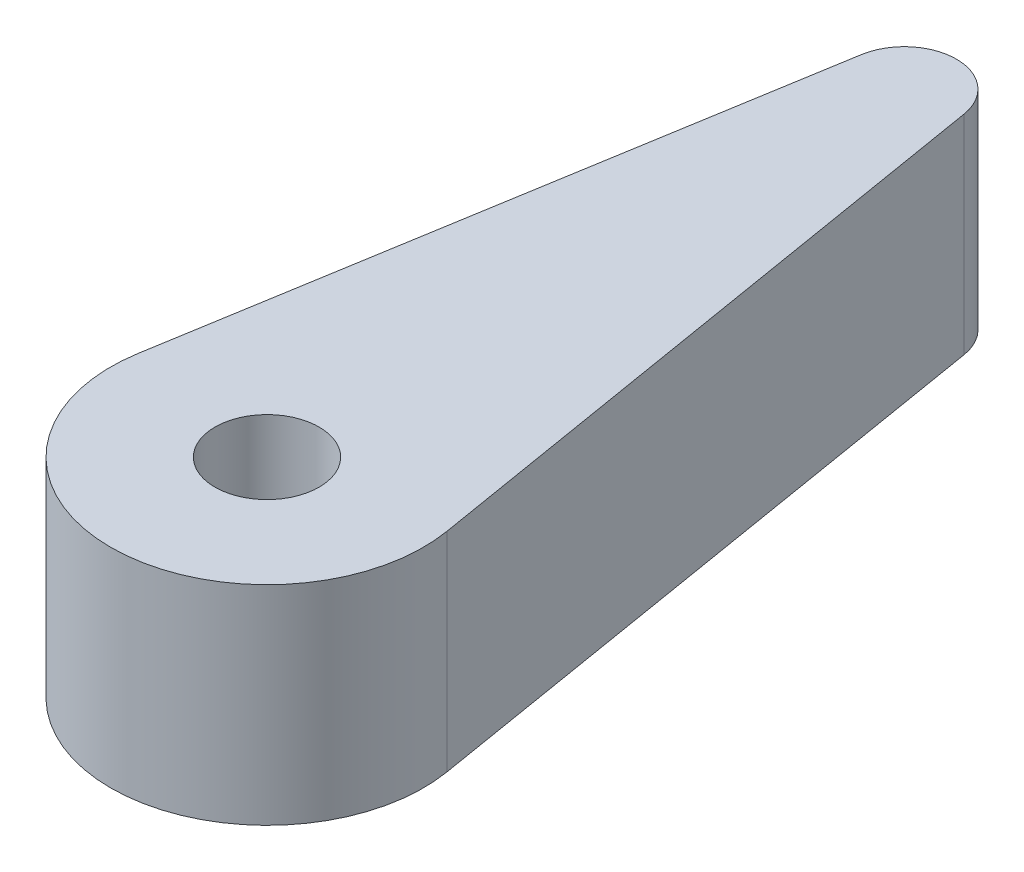
ISO-10303-21;
HEADER;
FILE_DESCRIPTION(('STEP AP214'),'2;1');
FILE_NAME('part.step','',(''),(''),'','','');
FILE_SCHEMA(('AUTOMOTIVE_DESIGN { 1 0 10303 214 1 1 1 1 }'));
ENDSEC;
DATA;
#1=APPLICATION_CONTEXT('core data for automotive mechanical design processes');
#2=APPLICATION_PROTOCOL_DEFINITION('international standard','automotive_design',2000,#1);
#3=PRODUCT_CONTEXT('',#1,'mechanical');
#4=PRODUCT('Part','Part','',(#3));
#5=PRODUCT_RELATED_PRODUCT_CATEGORY('part','',(#4));
#6=PRODUCT_DEFINITION_FORMATION('','',#4);
#7=PRODUCT_DEFINITION_CONTEXT('part definition',#1,'design');
#8=PRODUCT_DEFINITION('design','',#6,#7);
#9=PRODUCT_DEFINITION_SHAPE('','',#8);
#10=(LENGTH_UNIT() NAMED_UNIT(*) SI_UNIT(.MILLI.,.METRE.));
#11=(NAMED_UNIT(*) PLANE_ANGLE_UNIT() SI_UNIT($,.RADIAN.));
#12=(NAMED_UNIT(*) SI_UNIT($,.STERADIAN.) SOLID_ANGLE_UNIT());
#13=UNCERTAINTY_MEASURE_WITH_UNIT(LENGTH_MEASURE(1.E-05),#10,'distance_accuracy_value','');
#14=(GEOMETRIC_REPRESENTATION_CONTEXT(3) GLOBAL_UNCERTAINTY_ASSIGNED_CONTEXT((#13)) GLOBAL_UNIT_ASSIGNED_CONTEXT((#10,
#11,#12)) REPRESENTATION_CONTEXT('',''));
#15=CARTESIAN_POINT('',(0.,0.,0.));
#16=DIRECTION('',(0.,0.,1.));
#17=DIRECTION('',(1.,0.,0.));
#18=AXIS2_PLACEMENT_3D('',#15,#16,#17);
#19=CARTESIAN_POINT('',(0.,10.,0.));
#20=DIRECTION('',(0.,1.,0.));
#21=DIRECTION('',(0.,0.,1.));
#22=AXIS2_PLACEMENT_3D('',#19,#20,#21);
#23=PLANE('',#22);
#24=CARTESIAN_POINT('',(0.,10.,0.));
#25=DIRECTION('',(0.,1.,0.));
#26=DIRECTION('',(0.,0.,1.));
#27=AXIS2_PLACEMENT_3D('',#24,#25,#26);
#28=CIRCLE('',#27,7.5);
#29=CARTESIAN_POINT('',(-7.39904990575365,10.,-1.22640144005418));
#30=VERTEX_POINT('',#29);
#31=CARTESIAN_POINT('',(7.39904920314467,10.,-1.22640567898401));
#32=VERTEX_POINT('',#31);
#33=EDGE_CURVE('E92',#30,#32,#28,.T.);
#34=ORIENTED_EDGE('',*,*,#33,.T.);
#35=DIRECTION('',(-0.163520757197867,0.,-0.986539893752623));
#36=VECTOR('',#35,1.);
#37=CARTESIAN_POINT('',(7.39904920314467,10.,-1.22640567898401));
#38=LINE('',#37,#36);
#39=CARTESIAN_POINT('',(2.4678527212166,10.,-30.9768920191859));
#40=VERTEX_POINT('',#39);
#41=EDGE_CURVE('E87',#32,#40,#38,.T.);
#42=ORIENTED_EDGE('',*,*,#41,.T.);
#43=CARTESIAN_POINT('',(0.,10.,-30.5772635087117));
#44=DIRECTION('',(0.,1.,0.));
#45=DIRECTION('',(0.,0.,1.));
#46=AXIS2_PLACEMENT_3D('',#43,#44,#45);
#47=CIRCLE('',#46,2.5);
#48=CARTESIAN_POINT('',(-2.46634996858455,10.,-30.9860639887297));
#49=VERTEX_POINT('',#48);
#50=EDGE_CURVE('E90',#40,#49,#47,.T.);
#51=ORIENTED_EDGE('',*,*,#50,.T.);
#52=DIRECTION('',(-0.163520192007223,0.,0.98653998743382));
#53=VECTOR('',#52,1.);
#54=CARTESIAN_POINT('',(-7.39904990575365,10.,-1.22640144005418));
#55=LINE('',#54,#53);
#56=EDGE_CURVE('E57',#49,#30,#55,.T.);
#57=ORIENTED_EDGE('',*,*,#56,.T.);
#58=EDGE_LOOP('',(#34,#42,#51,#57));
#59=FACE_BOUND('',#58,.T.);
#60=CARTESIAN_POINT('',(0.,10.,0.));
#61=DIRECTION('',(0.,1.,0.));
#62=DIRECTION('',(0.,0.,1.));
#63=AXIS2_PLACEMENT_3D('',#60,#61,#62);
#64=CIRCLE('',#63,2.5);
#65=CARTESIAN_POINT('',(0.,10.,2.5));
#66=VERTEX_POINT('',#65);
#67=EDGE_CURVE('E112',#66,#66,#64,.T.);
#68=ORIENTED_EDGE('',*,*,#67,.F.);
#69=EDGE_LOOP('',(#68));
#70=FACE_BOUND('',#69,.T.);
#71=ADVANCED_FACE('F39',(#59,#70),#23,.T.);
#72=CARTESIAN_POINT('',(0.,0.,0.));
#73=DIRECTION('',(0.,1.,0.));
#74=DIRECTION('',(0.,0.,1.));
#75=AXIS2_PLACEMENT_3D('',#72,#73,#74);
#76=PLANE('',#75);
#77=CARTESIAN_POINT('',(0.,0.,0.));
#78=DIRECTION('',(0.,1.,0.));
#79=DIRECTION('',(0.,0.,1.));
#80=AXIS2_PLACEMENT_3D('',#77,#78,#79);
#81=CIRCLE('',#80,7.5);
#82=CARTESIAN_POINT('',(-7.39904990575365,0.,-1.22640144005418));
#83=VERTEX_POINT('',#82);
#84=CARTESIAN_POINT('',(7.39904920314467,0.,-1.22640567898401));
#85=VERTEX_POINT('',#84);
#86=EDGE_CURVE('E108',#83,#85,#81,.T.);
#87=ORIENTED_EDGE('',*,*,#86,.F.);
#88=DIRECTION('',(-0.163520192007223,0.,0.98653998743382));
#89=VECTOR('',#88,1.);
#90=CARTESIAN_POINT('',(-7.39904990575365,0.,-1.22640144005418));
#91=LINE('',#90,#89);
#92=CARTESIAN_POINT('',(-2.46634996858455,0.,-30.9860639887297));
#93=VERTEX_POINT('',#92);
#94=EDGE_CURVE('E80',#93,#83,#91,.T.);
#95=ORIENTED_EDGE('',*,*,#94,.F.);
#96=CARTESIAN_POINT('',(0.,0.,-30.5772635087117));
#97=DIRECTION('',(0.,1.,0.));
#98=DIRECTION('',(0.,0.,1.));
#99=AXIS2_PLACEMENT_3D('',#96,#97,#98);
#100=CIRCLE('',#99,2.5);
#101=CARTESIAN_POINT('',(2.4678527212166,0.,-30.9768920191859));
#102=VERTEX_POINT('',#101);
#103=EDGE_CURVE('E74',#102,#93,#100,.T.);
#104=ORIENTED_EDGE('',*,*,#103,.F.);
#105=DIRECTION('',(-0.163520757197867,0.,-0.986539893752623));
#106=VECTOR('',#105,1.);
#107=CARTESIAN_POINT('',(7.39904920314467,0.,-1.22640567898401));
#108=LINE('',#107,#106);
#109=EDGE_CURVE('E97',#85,#102,#108,.T.);
#110=ORIENTED_EDGE('',*,*,#109,.F.);
#111=EDGE_LOOP('',(#87,#95,#104,#110));
#112=FACE_BOUND('',#111,.T.);
#113=CARTESIAN_POINT('',(0.,0.,0.));
#114=DIRECTION('',(0.,1.,0.));
#115=DIRECTION('',(0.,0.,1.));
#116=AXIS2_PLACEMENT_3D('',#113,#114,#115);
#117=CIRCLE('',#116,2.5);
#118=CARTESIAN_POINT('',(0.,0.,2.5));
#119=VERTEX_POINT('',#118);
#120=EDGE_CURVE('E130',#119,#119,#117,.T.);
#121=ORIENTED_EDGE('',*,*,#120,.T.);
#122=EDGE_LOOP('',(#121));
#123=FACE_BOUND('',#122,.T.);
#124=ADVANCED_FACE('F125',(#112,#123),#76,.F.);
#125=CARTESIAN_POINT('',(0.,10.,0.));
#126=DIRECTION('',(0.,-1.,0.));
#127=DIRECTION('',(0.,0.,-1.));
#128=AXIS2_PLACEMENT_3D('',#125,#126,#127);
#129=CYLINDRICAL_SURFACE('',#128,7.5);
#130=ORIENTED_EDGE('',*,*,#86,.T.);
#131=DIRECTION('',(0.,-1.,0.));
#132=VECTOR('',#131,1.);
#133=CARTESIAN_POINT('',(7.39904920314467,10.,-1.22640567898401));
#134=LINE('',#133,#132);
#135=EDGE_CURVE('E11',#32,#85,#134,.T.);
#136=ORIENTED_EDGE('',*,*,#135,.F.);
#137=ORIENTED_EDGE('',*,*,#33,.F.);
#138=DIRECTION('',(0.,-1.,0.));
#139=VECTOR('',#138,1.);
#140=CARTESIAN_POINT('',(-7.39904990575365,10.,-1.22640144005418));
#141=LINE('',#140,#139);
#142=EDGE_CURVE('E104',#30,#83,#141,.T.);
#143=ORIENTED_EDGE('',*,*,#142,.T.);
#144=EDGE_LOOP('',(#130,#136,#137,#143));
#145=FACE_BOUND('',#144,.T.);
#146=ADVANCED_FACE('F41',(#145),#129,.T.);
#147=CARTESIAN_POINT('',(7.39904920314467,10.,-1.22640567898401));
#148=DIRECTION('',(-0.986539893752623,0.,0.163520757197867));
#149=DIRECTION('',(0.163520757197868,0.,0.986539893752623));
#150=AXIS2_PLACEMENT_3D('',#147,#148,#149);
#151=PLANE('',#150);
#152=ORIENTED_EDGE('',*,*,#109,.T.);
#153=DIRECTION('',(0.,-1.,0.));
#154=VECTOR('',#153,1.);
#155=CARTESIAN_POINT('',(2.4678527212166,10.,-30.9768920191859));
#156=LINE('',#155,#154);
#157=EDGE_CURVE('E49',#40,#102,#156,.T.);
#158=ORIENTED_EDGE('',*,*,#157,.F.);
#159=ORIENTED_EDGE('',*,*,#41,.F.);
#160=ORIENTED_EDGE('',*,*,#135,.T.);
#161=EDGE_LOOP('',(#152,#158,#159,#160));
#162=FACE_BOUND('',#161,.T.);
#163=ADVANCED_FACE('F96',(#162),#151,.F.);
#164=CARTESIAN_POINT('',(0.,10.,-30.5772635087117));
#165=DIRECTION('',(0.,-1.,0.));
#166=DIRECTION('',(0.,0.,-1.));
#167=AXIS2_PLACEMENT_3D('',#164,#165,#166);
#168=CYLINDRICAL_SURFACE('',#167,2.5);
#169=ORIENTED_EDGE('',*,*,#103,.T.);
#170=DIRECTION('',(0.,-1.,0.));
#171=VECTOR('',#170,1.);
#172=CARTESIAN_POINT('',(-2.46634996858455,10.,-30.9860639887297));
#173=LINE('',#172,#171);
#174=EDGE_CURVE('E99',#49,#93,#173,.T.);
#175=ORIENTED_EDGE('',*,*,#174,.F.);
#176=ORIENTED_EDGE('',*,*,#50,.F.);
#177=ORIENTED_EDGE('',*,*,#157,.T.);
#178=EDGE_LOOP('',(#169,#175,#176,#177));
#179=FACE_BOUND('',#178,.T.);
#180=ADVANCED_FACE('F100',(#179),#168,.T.);
#181=CARTESIAN_POINT('',(-7.39904990575365,10.,-1.22640144005418));
#182=DIRECTION('',(0.98653998743382,0.,0.163520192007223));
#183=DIRECTION('',(0.163520192007223,0.,-0.98653998743382));
#184=AXIS2_PLACEMENT_3D('',#181,#182,#183);
#185=PLANE('',#184);
#186=ORIENTED_EDGE('',*,*,#94,.T.);
#187=ORIENTED_EDGE('',*,*,#142,.F.);
#188=ORIENTED_EDGE('',*,*,#56,.F.);
#189=ORIENTED_EDGE('',*,*,#174,.T.);
#190=EDGE_LOOP('',(#186,#187,#188,#189));
#191=FACE_BOUND('',#190,.T.);
#192=ADVANCED_FACE('F122',(#191),#185,.F.);
#193=CARTESIAN_POINT('',(0.,10.,0.));
#194=DIRECTION('',(0.,-1.,0.));
#195=DIRECTION('',(0.,0.,-1.));
#196=AXIS2_PLACEMENT_3D('',#193,#194,#195);
#197=CYLINDRICAL_SURFACE('',#196,2.5);
#198=ORIENTED_EDGE('',*,*,#67,.T.);
#199=EDGE_LOOP('',(#198));
#200=FACE_BOUND('',#199,.T.);
#201=ORIENTED_EDGE('',*,*,#120,.F.);
#202=EDGE_LOOP('',(#201));
#203=FACE_BOUND('',#202,.T.);
#204=ADVANCED_FACE('F138',(#200,#203),#197,.F.);
#205=CLOSED_SHELL('',(#71,#124,#146,#163,#180,#192,#204));
#206=MANIFOLD_SOLID_BREP('B2',#205);
#207=ADVANCED_BREP_SHAPE_REPRESENTATION('',(#18,#206),#14);
#208=SHAPE_DEFINITION_REPRESENTATION(#9,#207);
ENDSEC;
END-ISO-10303-21;
